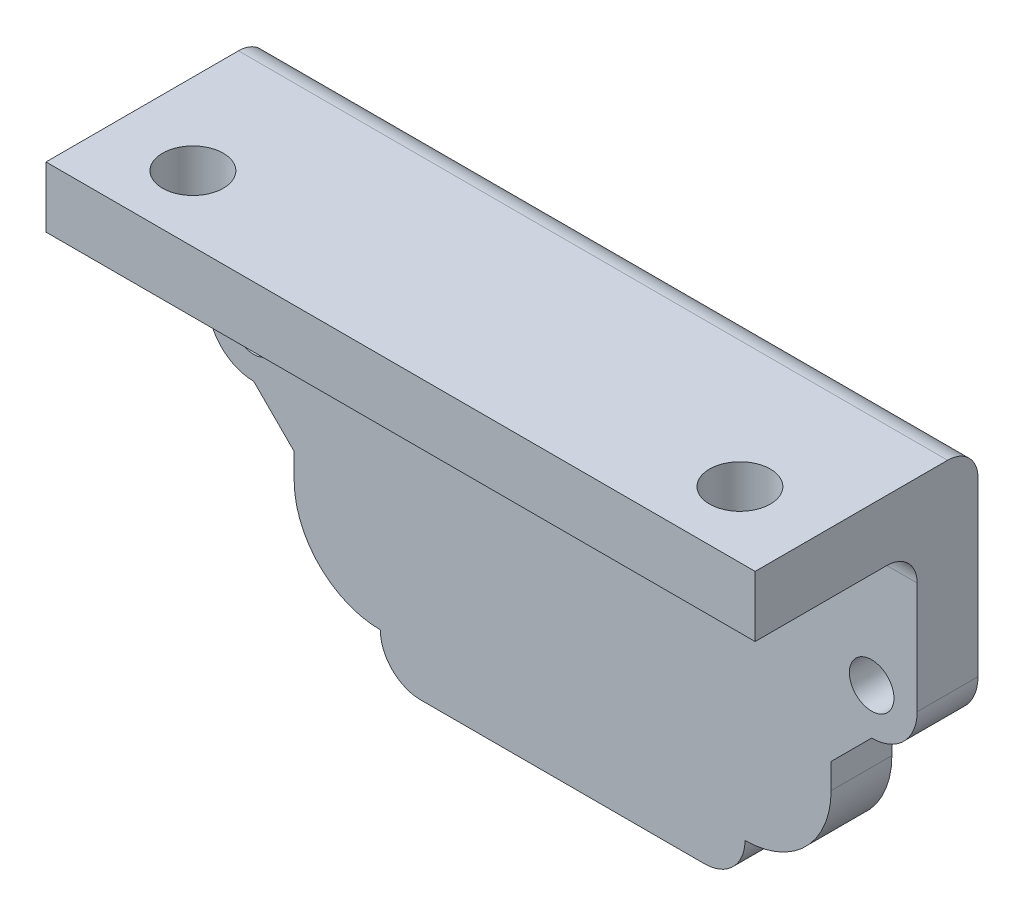
ISO-10303-21;
HEADER;
FILE_DESCRIPTION(('STEP AP214'),'2;1');
FILE_NAME('part.step','',(''),(''),'','','');
FILE_SCHEMA(('AUTOMOTIVE_DESIGN { 1 0 10303 214 1 1 1 1 }'));
ENDSEC;
DATA;
#1=APPLICATION_CONTEXT('core data for automotive mechanical design processes');
#2=APPLICATION_PROTOCOL_DEFINITION('international standard','automotive_design',2000,#1);
#3=PRODUCT_CONTEXT('',#1,'mechanical');
#4=PRODUCT('Part','Part','',(#3));
#5=PRODUCT_RELATED_PRODUCT_CATEGORY('part','',(#4));
#6=PRODUCT_DEFINITION_FORMATION('','',#4);
#7=PRODUCT_DEFINITION_CONTEXT('part definition',#1,'design');
#8=PRODUCT_DEFINITION('design','',#6,#7);
#9=PRODUCT_DEFINITION_SHAPE('','',#8);
#10=(LENGTH_UNIT() NAMED_UNIT(*) SI_UNIT(.MILLI.,.METRE.));
#11=(NAMED_UNIT(*) PLANE_ANGLE_UNIT() SI_UNIT($,.RADIAN.));
#12=(NAMED_UNIT(*) SI_UNIT($,.STERADIAN.) SOLID_ANGLE_UNIT());
#13=UNCERTAINTY_MEASURE_WITH_UNIT(LENGTH_MEASURE(1.E-05),#10,'distance_accuracy_value','');
#14=(GEOMETRIC_REPRESENTATION_CONTEXT(3) GLOBAL_UNCERTAINTY_ASSIGNED_CONTEXT((#13)) GLOBAL_UNIT_ASSIGNED_CONTEXT((#10,
#11,#12)) REPRESENTATION_CONTEXT('',''));
#15=CARTESIAN_POINT('',(0.,0.,0.));
#16=DIRECTION('',(0.,0.,1.));
#17=DIRECTION('',(1.,0.,0.));
#18=AXIS2_PLACEMENT_3D('',#15,#16,#17);
#19=CARTESIAN_POINT('',(15.25,1.625,3.));
#20=DIRECTION('',(0.,0.,1.));
#21=DIRECTION('',(1.,0.,0.));
#22=AXIS2_PLACEMENT_3D('',#19,#20,#21);
#23=PLANE('',#22);
#24=CARTESIAN_POINT('',(-15.25,1.625,3.));
#25=DIRECTION('',(0.,0.,1.));
#26=DIRECTION('',(1.,0.,0.));
#27=AXIS2_PLACEMENT_3D('',#24,#25,#26);
#28=CIRCLE('',#27,1.1);
#29=CARTESIAN_POINT('',(-14.15,1.625,3.));
#30=VERTEX_POINT('',#29);
#31=EDGE_CURVE('E215',#30,#30,#28,.T.);
#32=ORIENTED_EDGE('',*,*,#31,.F.);
#33=EDGE_LOOP('',(#32));
#34=FACE_BOUND('',#33,.T.);
#35=DIRECTION('',(1.,0.,0.));
#36=VECTOR('',#35,1.);
#37=CARTESIAN_POINT('',(9.,-10.125,3.));
#38=LINE('',#37,#36);
#39=CARTESIAN_POINT('',(-7.,-10.125,3.));
#40=VERTEX_POINT('',#39);
#41=CARTESIAN_POINT('',(7.,-10.125,3.));
#42=VERTEX_POINT('',#41);
#43=EDGE_CURVE('E239',#40,#42,#38,.T.);
#44=ORIENTED_EDGE('',*,*,#43,.T.);
#45=CARTESIAN_POINT('',(7.,-8.12499999999999,3.));
#46=DIRECTION('',(0.,0.,1.));
#47=DIRECTION('',(1.,0.,0.));
#48=AXIS2_PLACEMENT_3D('',#45,#46,#47);
#49=CIRCLE('',#48,2.);
#50=CARTESIAN_POINT('',(9.,-8.12499999999999,3.));
#51=VERTEX_POINT('',#50);
#52=EDGE_CURVE('E11',#42,#51,#49,.T.);
#53=ORIENTED_EDGE('',*,*,#52,.T.);
#54=CARTESIAN_POINT('',(9.,-3.87499999999999,3.));
#55=DIRECTION('',(0.,0.,1.));
#56=DIRECTION('',(1.,0.,0.));
#57=AXIS2_PLACEMENT_3D('',#54,#55,#56);
#58=CIRCLE('',#57,4.25);
#59=CARTESIAN_POINT('',(13.25,-3.87499999999999,3.));
#60=VERTEX_POINT('',#59);
#61=EDGE_CURVE('E242',#51,#60,#58,.T.);
#62=ORIENTED_EDGE('',*,*,#61,.T.);
#63=DIRECTION('',(0.,1.,0.));
#64=VECTOR('',#63,1.);
#65=CARTESIAN_POINT('',(13.25,-3.87499999999998,3.));
#66=LINE('',#65,#64);
#67=CARTESIAN_POINT('',(13.25,-2.62499999999997,3.));
#68=VERTEX_POINT('',#67);
#69=EDGE_CURVE('E245',#60,#68,#66,.T.);
#70=ORIENTED_EDGE('',*,*,#69,.T.);
#71=DIRECTION('',(0.707106781186551,0.707106781186544,0.));
#72=VECTOR('',#71,1.);
#73=CARTESIAN_POINT('',(15.25,-0.624999999999994,3.));
#74=LINE('',#73,#72);
#75=CARTESIAN_POINT('',(15.25,-0.624999999999994,3.));
#76=VERTEX_POINT('',#75);
#77=EDGE_CURVE('E248',#68,#76,#74,.T.);
#78=ORIENTED_EDGE('',*,*,#77,.T.);
#79=CARTESIAN_POINT('',(15.25,1.625,3.));
#80=DIRECTION('',(0.,0.,1.));
#81=DIRECTION('',(1.,0.,0.));
#82=AXIS2_PLACEMENT_3D('',#79,#80,#81);
#83=CIRCLE('',#82,2.25);
#84=CARTESIAN_POINT('',(17.5,1.625,3.));
#85=VERTEX_POINT('',#84);
#86=EDGE_CURVE('E251',#76,#85,#83,.T.);
#87=ORIENTED_EDGE('',*,*,#86,.T.);
#88=DIRECTION('',(0.,1.,0.));
#89=VECTOR('',#88,1.);
#90=CARTESIAN_POINT('',(17.5,1.625,3.));
#91=LINE('',#90,#89);
#92=CARTESIAN_POINT('',(17.5,7.125,3.));
#93=VERTEX_POINT('',#92);
#94=EDGE_CURVE('E254',#85,#93,#91,.T.);
#95=ORIENTED_EDGE('',*,*,#94,.T.);
#96=DIRECTION('',(-1.,0.,0.));
#97=VECTOR('',#96,1.);
#98=CARTESIAN_POINT('',(15.25,7.125,3.));
#99=LINE('',#98,#97);
#100=CARTESIAN_POINT('',(-17.5,7.125,3.));
#101=VERTEX_POINT('',#100);
#102=EDGE_CURVE('E331',#93,#101,#99,.T.);
#103=ORIENTED_EDGE('',*,*,#102,.T.);
#104=DIRECTION('',(0.,-1.,0.));
#105=VECTOR('',#104,1.);
#106=CARTESIAN_POINT('',(-17.5,1.625,3.));
#107=LINE('',#106,#105);
#108=CARTESIAN_POINT('',(-17.5,1.625,3.));
#109=VERTEX_POINT('',#108);
#110=EDGE_CURVE('E223',#101,#109,#107,.T.);
#111=ORIENTED_EDGE('',*,*,#110,.T.);
#112=CARTESIAN_POINT('',(-15.25,1.625,3.));
#113=DIRECTION('',(0.,0.,1.));
#114=DIRECTION('',(1.,0.,0.));
#115=AXIS2_PLACEMENT_3D('',#112,#113,#114);
#116=CIRCLE('',#115,2.24999999999999);
#117=CARTESIAN_POINT('',(-15.25,-0.62499999999999,3.));
#118=VERTEX_POINT('',#117);
#119=EDGE_CURVE('E226',#109,#118,#116,.T.);
#120=ORIENTED_EDGE('',*,*,#119,.T.);
#121=DIRECTION('',(0.707106781186548,-0.707106781186547,0.));
#122=VECTOR('',#121,1.);
#123=CARTESIAN_POINT('',(-15.25,-0.624999999999991,3.));
#124=LINE('',#123,#122);
#125=CARTESIAN_POINT('',(-13.25,-2.62499999999999,3.));
#126=VERTEX_POINT('',#125);
#127=EDGE_CURVE('E230',#118,#126,#124,.T.);
#128=ORIENTED_EDGE('',*,*,#127,.T.);
#129=DIRECTION('',(0.,-1.,0.));
#130=VECTOR('',#129,1.);
#131=CARTESIAN_POINT('',(-13.25,-3.87499999999999,3.));
#132=LINE('',#131,#130);
#133=CARTESIAN_POINT('',(-13.25,-3.87499999999999,3.));
#134=VERTEX_POINT('',#133);
#135=EDGE_CURVE('E233',#126,#134,#132,.T.);
#136=ORIENTED_EDGE('',*,*,#135,.T.);
#137=CARTESIAN_POINT('',(-9.,-3.87499999999999,3.));
#138=DIRECTION('',(0.,0.,1.));
#139=DIRECTION('',(1.,0.,0.));
#140=AXIS2_PLACEMENT_3D('',#137,#138,#139);
#141=CIRCLE('',#140,4.25000000000001);
#142=CARTESIAN_POINT('',(-9.,-8.125,3.));
#143=VERTEX_POINT('',#142);
#144=EDGE_CURVE('E236',#134,#143,#141,.T.);
#145=ORIENTED_EDGE('',*,*,#144,.T.);
#146=CARTESIAN_POINT('',(-7.,-8.12499999999999,3.));
#147=DIRECTION('',(0.,0.,1.));
#148=DIRECTION('',(1.,0.,0.));
#149=AXIS2_PLACEMENT_3D('',#146,#147,#148);
#150=CIRCLE('',#149,2.);
#151=EDGE_CURVE('E48',#143,#40,#150,.T.);
#152=ORIENTED_EDGE('',*,*,#151,.T.);
#153=EDGE_LOOP('',(#44,#53,#62,#70,#78,#87,#95,#103,#111,#120,#128,#136,#145,#152));
#154=FACE_BOUND('',#153,.T.);
#155=CARTESIAN_POINT('',(15.25,1.625,3.));
#156=DIRECTION('',(0.,0.,1.));
#157=DIRECTION('',(1.,0.,0.));
#158=AXIS2_PLACEMENT_3D('',#155,#156,#157);
#159=CIRCLE('',#158,1.1);
#160=CARTESIAN_POINT('',(16.35,1.625,3.));
#161=VERTEX_POINT('',#160);
#162=EDGE_CURVE('E207',#161,#161,#159,.T.);
#163=ORIENTED_EDGE('',*,*,#162,.F.);
#164=EDGE_LOOP('',(#163));
#165=FACE_BOUND('',#164,.T.);
#166=ADVANCED_FACE('F39',(#34,#154,#165),#23,.T.);
#167=CARTESIAN_POINT('',(15.25,1.625,0.));
#168=DIRECTION('',(0.,0.,1.));
#169=DIRECTION('',(1.,0.,0.));
#170=AXIS2_PLACEMENT_3D('',#167,#168,#169);
#171=PLANE('',#170);
#172=CARTESIAN_POINT('',(9.,-3.87499999999999,0.));
#173=DIRECTION('',(0.,0.,1.));
#174=DIRECTION('',(1.,0.,0.));
#175=AXIS2_PLACEMENT_3D('',#172,#173,#174);
#176=CIRCLE('',#175,4.25);
#177=CARTESIAN_POINT('',(9.,-8.12499999999999,0.));
#178=VERTEX_POINT('',#177);
#179=CARTESIAN_POINT('',(13.25,-3.87499999999999,0.));
#180=VERTEX_POINT('',#179);
#181=EDGE_CURVE('E277',#178,#180,#176,.T.);
#182=ORIENTED_EDGE('',*,*,#181,.F.);
#183=CARTESIAN_POINT('',(7.,-8.12499999999999,0.));
#184=DIRECTION('',(0.,0.,1.));
#185=DIRECTION('',(1.,0.,0.));
#186=AXIS2_PLACEMENT_3D('',#183,#184,#185);
#187=CIRCLE('',#186,2.);
#188=CARTESIAN_POINT('',(7.,-10.125,0.));
#189=VERTEX_POINT('',#188);
#190=EDGE_CURVE('E358',#178,#189,#187,.F.);
#191=ORIENTED_EDGE('',*,*,#190,.T.);
#192=DIRECTION('',(1.,0.,0.));
#193=VECTOR('',#192,1.);
#194=CARTESIAN_POINT('',(9.,-10.125,0.));
#195=LINE('',#194,#193);
#196=CARTESIAN_POINT('',(-7.,-10.125,0.));
#197=VERTEX_POINT('',#196);
#198=EDGE_CURVE('E274',#197,#189,#195,.T.);
#199=ORIENTED_EDGE('',*,*,#198,.F.);
#200=CARTESIAN_POINT('',(-7.,-8.12499999999999,0.));
#201=DIRECTION('',(0.,0.,1.));
#202=DIRECTION('',(1.,0.,0.));
#203=AXIS2_PLACEMENT_3D('',#200,#201,#202);
#204=CIRCLE('',#203,2.);
#205=CARTESIAN_POINT('',(-9.,-8.125,0.));
#206=VERTEX_POINT('',#205);
#207=EDGE_CURVE('E355',#197,#206,#204,.F.);
#208=ORIENTED_EDGE('',*,*,#207,.T.);
#209=CARTESIAN_POINT('',(-9.,-3.87499999999999,0.));
#210=DIRECTION('',(0.,0.,1.));
#211=DIRECTION('',(1.,0.,0.));
#212=AXIS2_PLACEMENT_3D('',#209,#210,#211);
#213=CIRCLE('',#212,4.25000000000001);
#214=CARTESIAN_POINT('',(-13.25,-3.87499999999999,0.));
#215=VERTEX_POINT('',#214);
#216=EDGE_CURVE('E270',#215,#206,#213,.T.);
#217=ORIENTED_EDGE('',*,*,#216,.F.);
#218=DIRECTION('',(0.,-1.,0.));
#219=VECTOR('',#218,1.);
#220=CARTESIAN_POINT('',(-13.25,-3.87499999999999,0.));
#221=LINE('',#220,#219);
#222=CARTESIAN_POINT('',(-13.25,-2.62499999999999,0.));
#223=VERTEX_POINT('',#222);
#224=EDGE_CURVE('E267',#223,#215,#221,.T.);
#225=ORIENTED_EDGE('',*,*,#224,.F.);
#226=DIRECTION('',(0.707106781186548,-0.707106781186547,0.));
#227=VECTOR('',#226,1.);
#228=CARTESIAN_POINT('',(-15.25,-0.624999999999991,0.));
#229=LINE('',#228,#227);
#230=CARTESIAN_POINT('',(-15.25,-0.62499999999999,0.));
#231=VERTEX_POINT('',#230);
#232=EDGE_CURVE('E264',#231,#223,#229,.T.);
#233=ORIENTED_EDGE('',*,*,#232,.F.);
#234=CARTESIAN_POINT('',(-15.25,1.625,0.));
#235=DIRECTION('',(0.,0.,1.));
#236=DIRECTION('',(1.,0.,0.));
#237=AXIS2_PLACEMENT_3D('',#234,#235,#236);
#238=CIRCLE('',#237,2.24999999999999);
#239=CARTESIAN_POINT('',(-17.5,1.625,0.));
#240=VERTEX_POINT('',#239);
#241=EDGE_CURVE('E261',#240,#231,#238,.T.);
#242=ORIENTED_EDGE('',*,*,#241,.F.);
#243=DIRECTION('',(0.,-1.,0.));
#244=VECTOR('',#243,1.);
#245=CARTESIAN_POINT('',(-17.5,1.625,0.));
#246=LINE('',#245,#244);
#247=CARTESIAN_POINT('',(-17.5,10.125,0.));
#248=VERTEX_POINT('',#247);
#249=EDGE_CURVE('E219',#248,#240,#246,.T.);
#250=ORIENTED_EDGE('',*,*,#249,.F.);
#251=DIRECTION('',(-1.,0.,0.));
#252=VECTOR('',#251,1.);
#253=CARTESIAN_POINT('',(17.5,10.125,0.));
#254=LINE('',#253,#252);
#255=CARTESIAN_POINT('',(17.5,10.125,0.));
#256=VERTEX_POINT('',#255);
#257=EDGE_CURVE('E343',#248,#256,#254,.F.);
#258=ORIENTED_EDGE('',*,*,#257,.T.);
#259=DIRECTION('',(0.,1.,0.));
#260=VECTOR('',#259,1.);
#261=CARTESIAN_POINT('',(17.5,1.625,0.));
#262=LINE('',#261,#260);
#263=CARTESIAN_POINT('',(17.5,1.625,0.));
#264=VERTEX_POINT('',#263);
#265=EDGE_CURVE('E227',#264,#256,#262,.T.);
#266=ORIENTED_EDGE('',*,*,#265,.F.);
#267=CARTESIAN_POINT('',(15.25,1.625,0.));
#268=DIRECTION('',(0.,0.,1.));
#269=DIRECTION('',(1.,0.,0.));
#270=AXIS2_PLACEMENT_3D('',#267,#268,#269);
#271=CIRCLE('',#270,2.25);
#272=CARTESIAN_POINT('',(15.25,-0.624999999999994,0.));
#273=VERTEX_POINT('',#272);
#274=EDGE_CURVE('E286',#273,#264,#271,.T.);
#275=ORIENTED_EDGE('',*,*,#274,.F.);
#276=DIRECTION('',(0.707106781186551,0.707106781186544,0.));
#277=VECTOR('',#276,1.);
#278=CARTESIAN_POINT('',(15.25,-0.624999999999994,0.));
#279=LINE('',#278,#277);
#280=CARTESIAN_POINT('',(13.25,-2.62499999999997,0.));
#281=VERTEX_POINT('',#280);
#282=EDGE_CURVE('E283',#281,#273,#279,.T.);
#283=ORIENTED_EDGE('',*,*,#282,.F.);
#284=DIRECTION('',(0.,1.,0.));
#285=VECTOR('',#284,1.);
#286=CARTESIAN_POINT('',(13.25,-3.87499999999998,0.));
#287=LINE('',#286,#285);
#288=EDGE_CURVE('E280',#180,#281,#287,.T.);
#289=ORIENTED_EDGE('',*,*,#288,.F.);
#290=EDGE_LOOP('',(#182,#191,#199,#208,#217,#225,#233,#242,#250,#258,#266,#275,#283,#289));
#291=FACE_BOUND('',#290,.T.);
#292=CARTESIAN_POINT('',(-15.25,1.625,0.));
#293=DIRECTION('',(0.,0.,1.));
#294=DIRECTION('',(1.,0.,0.));
#295=AXIS2_PLACEMENT_3D('',#292,#293,#294);
#296=CIRCLE('',#295,1.1);
#297=CARTESIAN_POINT('',(-14.15,1.625,0.));
#298=VERTEX_POINT('',#297);
#299=EDGE_CURVE('E211',#298,#298,#296,.T.);
#300=ORIENTED_EDGE('',*,*,#299,.T.);
#301=EDGE_LOOP('',(#300));
#302=FACE_BOUND('',#301,.T.);
#303=CARTESIAN_POINT('',(15.25,1.625,0.));
#304=DIRECTION('',(0.,0.,1.));
#305=DIRECTION('',(1.,0.,0.));
#306=AXIS2_PLACEMENT_3D('',#303,#304,#305);
#307=CIRCLE('',#306,1.1);
#308=CARTESIAN_POINT('',(16.35,1.625,0.));
#309=VERTEX_POINT('',#308);
#310=EDGE_CURVE('E185',#309,#309,#307,.T.);
#311=ORIENTED_EDGE('',*,*,#310,.T.);
#312=EDGE_LOOP('',(#311));
#313=FACE_BOUND('',#312,.T.);
#314=ADVANCED_FACE('F373',(#291,#302,#313),#171,.F.);
#315=CARTESIAN_POINT('',(-17.5,1.625,3.));
#316=DIRECTION('',(1.,0.,0.));
#317=DIRECTION('',(0.,1.,0.));
#318=AXIS2_PLACEMENT_3D('',#315,#316,#317);
#319=PLANE('',#318);
#320=DIRECTION('',(0.,0.,1.));
#321=VECTOR('',#320,1.);
#322=CARTESIAN_POINT('',(-17.5,11.625,0.));
#323=LINE('',#322,#321);
#324=CARTESIAN_POINT('',(-17.5,11.625,1.5));
#325=VERTEX_POINT('',#324);
#326=CARTESIAN_POINT('',(-17.5,11.625,11.));
#327=VERTEX_POINT('',#326);
#328=EDGE_CURVE('E164',#325,#327,#323,.T.);
#329=ORIENTED_EDGE('',*,*,#328,.F.);
#330=CARTESIAN_POINT('',(-17.5,10.125,1.5));
#331=DIRECTION('',(1.,0.,0.));
#332=DIRECTION('',(0.,1.,0.));
#333=AXIS2_PLACEMENT_3D('',#330,#331,#332);
#334=CIRCLE('',#333,1.5);
#335=EDGE_CURVE('E340',#325,#248,#334,.F.);
#336=ORIENTED_EDGE('',*,*,#335,.T.);
#337=ORIENTED_EDGE('',*,*,#249,.T.);
#338=DIRECTION('',(0.,0.,-1.));
#339=VECTOR('',#338,1.);
#340=CARTESIAN_POINT('',(-17.5,1.625,3.));
#341=LINE('',#340,#339);
#342=EDGE_CURVE('E327',#109,#240,#341,.T.);
#343=ORIENTED_EDGE('',*,*,#342,.F.);
#344=ORIENTED_EDGE('',*,*,#110,.F.);
#345=CARTESIAN_POINT('',(-17.5,7.125,4.5));
#346=DIRECTION('',(1.,0.,0.));
#347=DIRECTION('',(0.,1.,0.));
#348=AXIS2_PLACEMENT_3D('',#345,#346,#347);
#349=CIRCLE('',#348,1.5);
#350=CARTESIAN_POINT('',(-17.5,8.625,4.5));
#351=VERTEX_POINT('',#350);
#352=EDGE_CURVE('E349',#101,#351,#349,.T.);
#353=ORIENTED_EDGE('',*,*,#352,.T.);
#354=DIRECTION('',(0.,0.,1.));
#355=VECTOR('',#354,1.);
#356=CARTESIAN_POINT('',(-17.5,8.625,0.));
#357=LINE('',#356,#355);
#358=CARTESIAN_POINT('',(-17.5,8.625,11.));
#359=VERTEX_POINT('',#358);
#360=EDGE_CURVE('E181',#351,#359,#357,.T.);
#361=ORIENTED_EDGE('',*,*,#360,.T.);
#362=DIRECTION('',(0.,-1.,0.));
#363=VECTOR('',#362,1.);
#364=CARTESIAN_POINT('',(-17.5,11.625,11.));
#365=LINE('',#364,#363);
#366=EDGE_CURVE('E178',#327,#359,#365,.T.);
#367=ORIENTED_EDGE('',*,*,#366,.F.);
#368=EDGE_LOOP('',(#329,#336,#337,#343,#344,#353,#361,#367));
#369=FACE_BOUND('',#368,.T.);
#370=ADVANCED_FACE('F179',(#369),#319,.F.);
#371=CARTESIAN_POINT('',(-15.25,1.625,3.));
#372=DIRECTION('',(0.,0.,-1.));
#373=DIRECTION('',(-1.,0.,0.));
#374=AXIS2_PLACEMENT_3D('',#371,#372,#373);
#375=CYLINDRICAL_SURFACE('',#374,2.24999999999999);
#376=ORIENTED_EDGE('',*,*,#241,.T.);
#377=DIRECTION('',(0.,0.,-1.));
#378=VECTOR('',#377,1.);
#379=CARTESIAN_POINT('',(-15.25,-0.62499999999999,3.));
#380=LINE('',#379,#378);
#381=EDGE_CURVE('E323',#118,#231,#380,.T.);
#382=ORIENTED_EDGE('',*,*,#381,.F.);
#383=ORIENTED_EDGE('',*,*,#119,.F.);
#384=ORIENTED_EDGE('',*,*,#342,.T.);
#385=EDGE_LOOP('',(#376,#382,#383,#384));
#386=FACE_BOUND('',#385,.T.);
#387=ADVANCED_FACE('F492',(#386),#375,.T.);
#388=CARTESIAN_POINT('',(-15.25,-0.624999999999991,3.));
#389=DIRECTION('',(0.707106781186547,0.707106781186548,0.));
#390=DIRECTION('',(-0.707106781186548,0.707106781186547,0.));
#391=AXIS2_PLACEMENT_3D('',#388,#389,#390);
#392=PLANE('',#391);
#393=ORIENTED_EDGE('',*,*,#232,.T.);
#394=DIRECTION('',(0.,0.,-1.));
#395=VECTOR('',#394,1.);
#396=CARTESIAN_POINT('',(-13.25,-2.62499999999999,3.));
#397=LINE('',#396,#395);
#398=EDGE_CURVE('E319',#126,#223,#397,.T.);
#399=ORIENTED_EDGE('',*,*,#398,.F.);
#400=ORIENTED_EDGE('',*,*,#127,.F.);
#401=ORIENTED_EDGE('',*,*,#381,.T.);
#402=EDGE_LOOP('',(#393,#399,#400,#401));
#403=FACE_BOUND('',#402,.T.);
#404=ADVANCED_FACE('F488',(#403),#392,.F.);
#405=CARTESIAN_POINT('',(-13.25,-3.87499999999999,3.));
#406=DIRECTION('',(1.,0.,0.));
#407=DIRECTION('',(0.,0.,-1.));
#408=AXIS2_PLACEMENT_3D('',#405,#406,#407);
#409=PLANE('',#408);
#410=ORIENTED_EDGE('',*,*,#224,.T.);
#411=DIRECTION('',(0.,0.,-1.));
#412=VECTOR('',#411,1.);
#413=CARTESIAN_POINT('',(-13.25,-3.87499999999999,3.));
#414=LINE('',#413,#412);
#415=EDGE_CURVE('E315',#134,#215,#414,.T.);
#416=ORIENTED_EDGE('',*,*,#415,.F.);
#417=ORIENTED_EDGE('',*,*,#135,.F.);
#418=ORIENTED_EDGE('',*,*,#398,.T.);
#419=EDGE_LOOP('',(#410,#416,#417,#418));
#420=FACE_BOUND('',#419,.T.);
#421=ADVANCED_FACE('F484',(#420),#409,.F.);
#422=CARTESIAN_POINT('',(-9.,-3.87499999999999,3.));
#423=DIRECTION('',(0.,0.,-1.));
#424=DIRECTION('',(-1.,0.,0.));
#425=AXIS2_PLACEMENT_3D('',#422,#423,#424);
#426=CYLINDRICAL_SURFACE('',#425,4.25000000000001);
#427=ORIENTED_EDGE('',*,*,#216,.T.);
#428=DIRECTION('',(0.,0.,-1.));
#429=VECTOR('',#428,1.);
#430=CARTESIAN_POINT('',(-9.,-8.125,3.));
#431=LINE('',#430,#429);
#432=EDGE_CURVE('E311',#143,#206,#431,.T.);
#433=ORIENTED_EDGE('',*,*,#432,.F.);
#434=ORIENTED_EDGE('',*,*,#144,.F.);
#435=ORIENTED_EDGE('',*,*,#415,.T.);
#436=EDGE_LOOP('',(#427,#433,#434,#435));
#437=FACE_BOUND('',#436,.T.);
#438=ADVANCED_FACE('F481',(#437),#426,.T.);
#439=CARTESIAN_POINT('',(9.,-10.125,3.));
#440=DIRECTION('',(0.,1.,0.));
#441=DIRECTION('',(0.,0.,1.));
#442=AXIS2_PLACEMENT_3D('',#439,#440,#441);
#443=PLANE('',#442);
#444=ORIENTED_EDGE('',*,*,#198,.T.);
#445=DIRECTION('',(0.,0.,-1.));
#446=VECTOR('',#445,1.);
#447=CARTESIAN_POINT('',(7.,-10.125,3.));
#448=LINE('',#447,#446);
#449=EDGE_CURVE('E55',#189,#42,#448,.F.);
#450=ORIENTED_EDGE('',*,*,#449,.T.);
#451=ORIENTED_EDGE('',*,*,#43,.F.);
#452=DIRECTION('',(0.,0.,-1.));
#453=VECTOR('',#452,1.);
#454=CARTESIAN_POINT('',(-7.,-10.125,3.));
#455=LINE('',#454,#453);
#456=EDGE_CURVE('E361',#40,#197,#455,.T.);
#457=ORIENTED_EDGE('',*,*,#456,.T.);
#458=EDGE_LOOP('',(#444,#450,#451,#457));
#459=FACE_BOUND('',#458,.T.);
#460=ADVANCED_FACE('F369',(#459),#443,.F.);
#461=CARTESIAN_POINT('',(9.,-3.87499999999999,3.));
#462=DIRECTION('',(0.,0.,-1.));
#463=DIRECTION('',(-1.,0.,0.));
#464=AXIS2_PLACEMENT_3D('',#461,#462,#463);
#465=CYLINDRICAL_SURFACE('',#464,4.25);
#466=ORIENTED_EDGE('',*,*,#181,.T.);
#467=DIRECTION('',(0.,0.,-1.));
#468=VECTOR('',#467,1.);
#469=CARTESIAN_POINT('',(13.25,-3.87499999999999,3.));
#470=LINE('',#469,#468);
#471=EDGE_CURVE('E303',#60,#180,#470,.T.);
#472=ORIENTED_EDGE('',*,*,#471,.F.);
#473=ORIENTED_EDGE('',*,*,#61,.F.);
#474=DIRECTION('',(0.,0.,-1.));
#475=VECTOR('',#474,1.);
#476=CARTESIAN_POINT('',(9.,-8.12499999999999,3.));
#477=LINE('',#476,#475);
#478=EDGE_CURVE('E307',#51,#178,#477,.T.);
#479=ORIENTED_EDGE('',*,*,#478,.T.);
#480=EDGE_LOOP('',(#466,#472,#473,#479));
#481=FACE_BOUND('',#480,.T.);
#482=ADVANCED_FACE('F383',(#481),#465,.T.);
#483=CARTESIAN_POINT('',(13.25,-3.87499999999998,3.));
#484=DIRECTION('',(-1.,0.,0.));
#485=DIRECTION('',(0.,0.,1.));
#486=AXIS2_PLACEMENT_3D('',#483,#484,#485);
#487=PLANE('',#486);
#488=ORIENTED_EDGE('',*,*,#288,.T.);
#489=DIRECTION('',(0.,0.,-1.));
#490=VECTOR('',#489,1.);
#491=CARTESIAN_POINT('',(13.25,-2.62499999999997,3.));
#492=LINE('',#491,#490);
#493=EDGE_CURVE('E299',#68,#281,#492,.T.);
#494=ORIENTED_EDGE('',*,*,#493,.F.);
#495=ORIENTED_EDGE('',*,*,#69,.F.);
#496=ORIENTED_EDGE('',*,*,#471,.T.);
#497=EDGE_LOOP('',(#488,#494,#495,#496));
#498=FACE_BOUND('',#497,.T.);
#499=ADVANCED_FACE('F391',(#498),#487,.F.);
#500=CARTESIAN_POINT('',(15.25,-0.624999999999994,3.));
#501=DIRECTION('',(-0.707106781186544,0.70710678118655,0.));
#502=DIRECTION('',(-0.707106781186551,-0.707106781186545,0.));
#503=AXIS2_PLACEMENT_3D('',#500,#501,#502);
#504=PLANE('',#503);
#505=ORIENTED_EDGE('',*,*,#282,.T.);
#506=DIRECTION('',(0.,0.,-1.));
#507=VECTOR('',#506,1.);
#508=CARTESIAN_POINT('',(15.25,-0.624999999999994,3.));
#509=LINE('',#508,#507);
#510=EDGE_CURVE('E295',#76,#273,#509,.T.);
#511=ORIENTED_EDGE('',*,*,#510,.F.);
#512=ORIENTED_EDGE('',*,*,#77,.F.);
#513=ORIENTED_EDGE('',*,*,#493,.T.);
#514=EDGE_LOOP('',(#505,#511,#512,#513));
#515=FACE_BOUND('',#514,.T.);
#516=ADVANCED_FACE('F394',(#515),#504,.F.);
#517=CARTESIAN_POINT('',(15.25,1.625,3.));
#518=DIRECTION('',(0.,0.,-1.));
#519=DIRECTION('',(-1.,0.,0.));
#520=AXIS2_PLACEMENT_3D('',#517,#518,#519);
#521=CYLINDRICAL_SURFACE('',#520,2.25);
#522=ORIENTED_EDGE('',*,*,#274,.T.);
#523=DIRECTION('',(0.,0.,-1.));
#524=VECTOR('',#523,1.);
#525=CARTESIAN_POINT('',(17.5,1.625,3.));
#526=LINE('',#525,#524);
#527=EDGE_CURVE('E258',#85,#264,#526,.T.);
#528=ORIENTED_EDGE('',*,*,#527,.F.);
#529=ORIENTED_EDGE('',*,*,#86,.F.);
#530=ORIENTED_EDGE('',*,*,#510,.T.);
#531=EDGE_LOOP('',(#522,#528,#529,#530));
#532=FACE_BOUND('',#531,.T.);
#533=ADVANCED_FACE('F399',(#532),#521,.T.);
#534=CARTESIAN_POINT('',(17.5,1.625,3.));
#535=DIRECTION('',(-1.,0.,0.));
#536=DIRECTION('',(0.,-1.,0.));
#537=AXIS2_PLACEMENT_3D('',#534,#535,#536);
#538=PLANE('',#537);
#539=ORIENTED_EDGE('',*,*,#265,.T.);
#540=CARTESIAN_POINT('',(17.5,10.125,1.5));
#541=DIRECTION('',(-1.,0.,0.));
#542=DIRECTION('',(0.,-1.,0.));
#543=AXIS2_PLACEMENT_3D('',#540,#541,#542);
#544=CIRCLE('',#543,1.5);
#545=CARTESIAN_POINT('',(17.5,11.625,1.5));
#546=VERTEX_POINT('',#545);
#547=EDGE_CURVE('E346',#256,#546,#544,.F.);
#548=ORIENTED_EDGE('',*,*,#547,.T.);
#549=DIRECTION('',(0.,0.,-1.));
#550=VECTOR('',#549,1.);
#551=CARTESIAN_POINT('',(17.5,11.625,11.));
#552=LINE('',#551,#550);
#553=CARTESIAN_POINT('',(17.5,11.625,11.));
#554=VERTEX_POINT('',#553);
#555=EDGE_CURVE('E175',#554,#546,#552,.T.);
#556=ORIENTED_EDGE('',*,*,#555,.F.);
#557=DIRECTION('',(0.,-1.,0.));
#558=VECTOR('',#557,1.);
#559=CARTESIAN_POINT('',(17.5,11.625,11.));
#560=LINE('',#559,#558);
#561=CARTESIAN_POINT('',(17.5,8.625,11.));
#562=VERTEX_POINT('',#561);
#563=EDGE_CURVE('E186',#554,#562,#560,.T.);
#564=ORIENTED_EDGE('',*,*,#563,.T.);
#565=DIRECTION('',(0.,0.,-1.));
#566=VECTOR('',#565,1.);
#567=CARTESIAN_POINT('',(17.5,8.625,11.));
#568=LINE('',#567,#566);
#569=CARTESIAN_POINT('',(17.5,8.625,4.5));
#570=VERTEX_POINT('',#569);
#571=EDGE_CURVE('E197',#562,#570,#568,.T.);
#572=ORIENTED_EDGE('',*,*,#571,.T.);
#573=CARTESIAN_POINT('',(17.5,7.125,4.5));
#574=DIRECTION('',(-1.,0.,0.));
#575=DIRECTION('',(0.,-1.,0.));
#576=AXIS2_PLACEMENT_3D('',#573,#574,#575);
#577=CIRCLE('',#576,1.5);
#578=EDGE_CURVE('E352',#570,#93,#577,.T.);
#579=ORIENTED_EDGE('',*,*,#578,.T.);
#580=ORIENTED_EDGE('',*,*,#94,.F.);
#581=ORIENTED_EDGE('',*,*,#527,.T.);
#582=EDGE_LOOP('',(#539,#548,#556,#564,#572,#579,#580,#581));
#583=FACE_BOUND('',#582,.T.);
#584=ADVANCED_FACE('F412',(#583),#538,.F.);
#585=CARTESIAN_POINT('',(-15.25,1.625,3.));
#586=DIRECTION('',(0.,0.,-1.));
#587=DIRECTION('',(-1.,0.,0.));
#588=AXIS2_PLACEMENT_3D('',#585,#586,#587);
#589=CYLINDRICAL_SURFACE('',#588,1.1);
#590=ORIENTED_EDGE('',*,*,#31,.T.);
#591=EDGE_LOOP('',(#590));
#592=FACE_BOUND('',#591,.T.);
#593=ORIENTED_EDGE('',*,*,#299,.F.);
#594=EDGE_LOOP('',(#593));
#595=FACE_BOUND('',#594,.T.);
#596=ADVANCED_FACE('F466',(#592,#595),#589,.F.);
#597=CARTESIAN_POINT('',(15.25,1.625,3.));
#598=DIRECTION('',(0.,0.,-1.));
#599=DIRECTION('',(-1.,0.,0.));
#600=AXIS2_PLACEMENT_3D('',#597,#598,#599);
#601=CYLINDRICAL_SURFACE('',#600,1.1);
#602=ORIENTED_EDGE('',*,*,#162,.T.);
#603=EDGE_LOOP('',(#602));
#604=FACE_BOUND('',#603,.T.);
#605=ORIENTED_EDGE('',*,*,#310,.F.);
#606=EDGE_LOOP('',(#605));
#607=FACE_BOUND('',#606,.T.);
#608=ADVANCED_FACE('F615',(#604,#607),#601,.F.);
#609=CARTESIAN_POINT('',(-17.5,11.625,11.));
#610=DIRECTION('',(0.,0.,-1.));
#611=DIRECTION('',(-1.,0.,0.));
#612=AXIS2_PLACEMENT_3D('',#609,#610,#611);
#613=PLANE('',#612);
#614=DIRECTION('',(1.,0.,0.));
#615=VECTOR('',#614,1.);
#616=CARTESIAN_POINT('',(-17.5,8.625,11.));
#617=LINE('',#616,#615);
#618=EDGE_CURVE('E204',#359,#562,#617,.T.);
#619=ORIENTED_EDGE('',*,*,#618,.T.);
#620=ORIENTED_EDGE('',*,*,#563,.F.);
#621=DIRECTION('',(1.,0.,0.));
#622=VECTOR('',#621,1.);
#623=CARTESIAN_POINT('',(-17.5,11.625,11.));
#624=LINE('',#623,#622);
#625=EDGE_CURVE('E169',#327,#554,#624,.T.);
#626=ORIENTED_EDGE('',*,*,#625,.F.);
#627=ORIENTED_EDGE('',*,*,#366,.T.);
#628=EDGE_LOOP('',(#619,#620,#626,#627));
#629=FACE_BOUND('',#628,.T.);
#630=ADVANCED_FACE('F188',(#629),#613,.F.);
#631=CARTESIAN_POINT('',(0.,11.625,0.));
#632=DIRECTION('',(0.,1.,0.));
#633=DIRECTION('',(0.,0.,1.));
#634=AXIS2_PLACEMENT_3D('',#631,#632,#633);
#635=PLANE('',#634);
#636=CARTESIAN_POINT('',(13.5,11.625,7.75));
#637=DIRECTION('',(0.,-1.,0.));
#638=DIRECTION('',(0.,0.,-1.));
#639=AXIS2_PLACEMENT_3D('',#636,#637,#638);
#640=CIRCLE('',#639,1.5);
#641=CARTESIAN_POINT('',(13.5,11.625,6.25));
#642=VERTEX_POINT('',#641);
#643=EDGE_CURVE('E201',#642,#642,#640,.T.);
#644=ORIENTED_EDGE('',*,*,#643,.T.);
#645=EDGE_LOOP('',(#644));
#646=FACE_BOUND('',#645,.T.);
#647=CARTESIAN_POINT('',(-13.5,11.625,7.75));
#648=DIRECTION('',(0.,-1.,0.));
#649=DIRECTION('',(0.,0.,-1.));
#650=AXIS2_PLACEMENT_3D('',#647,#648,#649);
#651=CIRCLE('',#650,1.5);
#652=CARTESIAN_POINT('',(-13.5,11.625,6.25));
#653=VERTEX_POINT('',#652);
#654=EDGE_CURVE('E420',#653,#653,#651,.T.);
#655=ORIENTED_EDGE('',*,*,#654,.T.);
#656=EDGE_LOOP('',(#655));
#657=FACE_BOUND('',#656,.T.);
#658=ORIENTED_EDGE('',*,*,#555,.T.);
#659=DIRECTION('',(-1.,0.,0.));
#660=VECTOR('',#659,1.);
#661=CARTESIAN_POINT('',(-17.5,11.625,1.5));
#662=LINE('',#661,#660);
#663=EDGE_CURVE('E172',#546,#325,#662,.T.);
#664=ORIENTED_EDGE('',*,*,#663,.T.);
#665=ORIENTED_EDGE('',*,*,#328,.T.);
#666=ORIENTED_EDGE('',*,*,#625,.T.);
#667=EDGE_LOOP('',(#658,#664,#665,#666));
#668=FACE_BOUND('',#667,.T.);
#669=ADVANCED_FACE('F167',(#646,#657,#668),#635,.T.);
#670=CARTESIAN_POINT('',(0.,8.625,0.));
#671=DIRECTION('',(0.,1.,0.));
#672=DIRECTION('',(0.,0.,1.));
#673=AXIS2_PLACEMENT_3D('',#670,#671,#672);
#674=PLANE('',#673);
#675=CARTESIAN_POINT('',(13.5,8.625,7.75));
#676=DIRECTION('',(0.,-1.,0.));
#677=DIRECTION('',(0.,0.,-1.));
#678=AXIS2_PLACEMENT_3D('',#675,#676,#677);
#679=CIRCLE('',#678,1.5);
#680=CARTESIAN_POINT('',(13.5,8.625,6.25));
#681=VERTEX_POINT('',#680);
#682=EDGE_CURVE('E424',#681,#681,#679,.T.);
#683=ORIENTED_EDGE('',*,*,#682,.F.);
#684=EDGE_LOOP('',(#683));
#685=FACE_BOUND('',#684,.T.);
#686=CARTESIAN_POINT('',(-13.5,8.625,7.75));
#687=DIRECTION('',(0.,-1.,0.));
#688=DIRECTION('',(0.,0.,-1.));
#689=AXIS2_PLACEMENT_3D('',#686,#687,#688);
#690=CIRCLE('',#689,1.5);
#691=CARTESIAN_POINT('',(-13.5,8.625,6.25));
#692=VERTEX_POINT('',#691);
#693=EDGE_CURVE('E416',#692,#692,#690,.T.);
#694=ORIENTED_EDGE('',*,*,#693,.F.);
#695=EDGE_LOOP('',(#694));
#696=FACE_BOUND('',#695,.T.);
#697=ORIENTED_EDGE('',*,*,#360,.F.);
#698=DIRECTION('',(-1.,0.,0.));
#699=VECTOR('',#698,1.);
#700=CARTESIAN_POINT('',(0.,8.625,4.5));
#701=LINE('',#700,#699);
#702=EDGE_CURVE('E335',#351,#570,#701,.F.);
#703=ORIENTED_EDGE('',*,*,#702,.T.);
#704=ORIENTED_EDGE('',*,*,#571,.F.);
#705=ORIENTED_EDGE('',*,*,#618,.F.);
#706=EDGE_LOOP('',(#697,#703,#704,#705));
#707=FACE_BOUND('',#706,.T.);
#708=ADVANCED_FACE('F410',(#685,#696,#707),#674,.F.);
#709=CARTESIAN_POINT('',(15.25,7.125,4.5));
#710=DIRECTION('',(-1.,0.,0.));
#711=DIRECTION('',(0.,0.,1.));
#712=AXIS2_PLACEMENT_3D('',#709,#710,#711);
#713=CYLINDRICAL_SURFACE('',#712,1.5);
#714=ORIENTED_EDGE('',*,*,#578,.F.);
#715=ORIENTED_EDGE('',*,*,#702,.F.);
#716=ORIENTED_EDGE('',*,*,#352,.F.);
#717=ORIENTED_EDGE('',*,*,#102,.F.);
#718=EDGE_LOOP('',(#714,#715,#716,#717));
#719=FACE_BOUND('',#718,.T.);
#720=ADVANCED_FACE('F406',(#719),#713,.F.);
#721=CARTESIAN_POINT('',(0.,10.125,1.5));
#722=DIRECTION('',(1.,0.,0.));
#723=DIRECTION('',(0.,0.,-1.));
#724=AXIS2_PLACEMENT_3D('',#721,#722,#723);
#725=CYLINDRICAL_SURFACE('',#724,1.5);
#726=ORIENTED_EDGE('',*,*,#547,.F.);
#727=ORIENTED_EDGE('',*,*,#257,.F.);
#728=ORIENTED_EDGE('',*,*,#335,.F.);
#729=ORIENTED_EDGE('',*,*,#663,.F.);
#730=EDGE_LOOP('',(#726,#727,#728,#729));
#731=FACE_BOUND('',#730,.T.);
#732=ADVANCED_FACE('F447',(#731),#725,.T.);
#733=CARTESIAN_POINT('',(-13.5,11.625,7.75));
#734=DIRECTION('',(0.,-1.,0.));
#735=DIRECTION('',(0.,0.,-1.));
#736=AXIS2_PLACEMENT_3D('',#733,#734,#735);
#737=CYLINDRICAL_SURFACE('',#736,1.5);
#738=ORIENTED_EDGE('',*,*,#654,.F.);
#739=EDGE_LOOP('',(#738));
#740=FACE_BOUND('',#739,.T.);
#741=ORIENTED_EDGE('',*,*,#693,.T.);
#742=EDGE_LOOP('',(#741));
#743=FACE_BOUND('',#742,.T.);
#744=ADVANCED_FACE('F437',(#740,#743),#737,.F.);
#745=CARTESIAN_POINT('',(13.5,11.625,7.75));
#746=DIRECTION('',(0.,-1.,0.));
#747=DIRECTION('',(0.,0.,-1.));
#748=AXIS2_PLACEMENT_3D('',#745,#746,#747);
#749=CYLINDRICAL_SURFACE('',#748,1.5);
#750=ORIENTED_EDGE('',*,*,#643,.F.);
#751=EDGE_LOOP('',(#750));
#752=FACE_BOUND('',#751,.T.);
#753=ORIENTED_EDGE('',*,*,#682,.T.);
#754=EDGE_LOOP('',(#753));
#755=FACE_BOUND('',#754,.T.);
#756=ADVANCED_FACE('F434',(#752,#755),#749,.F.);
#757=CARTESIAN_POINT('',(7.,-8.12499999999999,3.));
#758=DIRECTION('',(0.,0.,-1.));
#759=DIRECTION('',(-1.,0.,0.));
#760=AXIS2_PLACEMENT_3D('',#757,#758,#759);
#761=CYLINDRICAL_SURFACE('',#760,2.);
#762=ORIENTED_EDGE('',*,*,#52,.F.);
#763=ORIENTED_EDGE('',*,*,#449,.F.);
#764=ORIENTED_EDGE('',*,*,#190,.F.);
#765=ORIENTED_EDGE('',*,*,#478,.F.);
#766=EDGE_LOOP('',(#762,#763,#764,#765));
#767=FACE_BOUND('',#766,.T.);
#768=ADVANCED_FACE('F380',(#767),#761,.T.);
#769=CARTESIAN_POINT('',(-7.,-8.12499999999999,3.));
#770=DIRECTION('',(0.,0.,-1.));
#771=DIRECTION('',(-1.,0.,0.));
#772=AXIS2_PLACEMENT_3D('',#769,#770,#771);
#773=CYLINDRICAL_SURFACE('',#772,2.);
#774=ORIENTED_EDGE('',*,*,#151,.F.);
#775=ORIENTED_EDGE('',*,*,#432,.T.);
#776=ORIENTED_EDGE('',*,*,#207,.F.);
#777=ORIENTED_EDGE('',*,*,#456,.F.);
#778=EDGE_LOOP('',(#774,#775,#776,#777));
#779=FACE_BOUND('',#778,.T.);
#780=ADVANCED_FACE('F41',(#779),#773,.T.);
#781=CLOSED_SHELL('',(#166,#314,#370,#387,#404,#421,#438,#460,#482,#499,#516,#533,#584,#596,
#608,#630,#669,#708,#720,#732,#744,#756,#768,#780));
#782=MANIFOLD_SOLID_BREP('B2',#781);
#783=ADVANCED_BREP_SHAPE_REPRESENTATION('',(#18,#782),#14);
#784=SHAPE_DEFINITION_REPRESENTATION(#9,#783);
ENDSEC;
END-ISO-10303-21;
